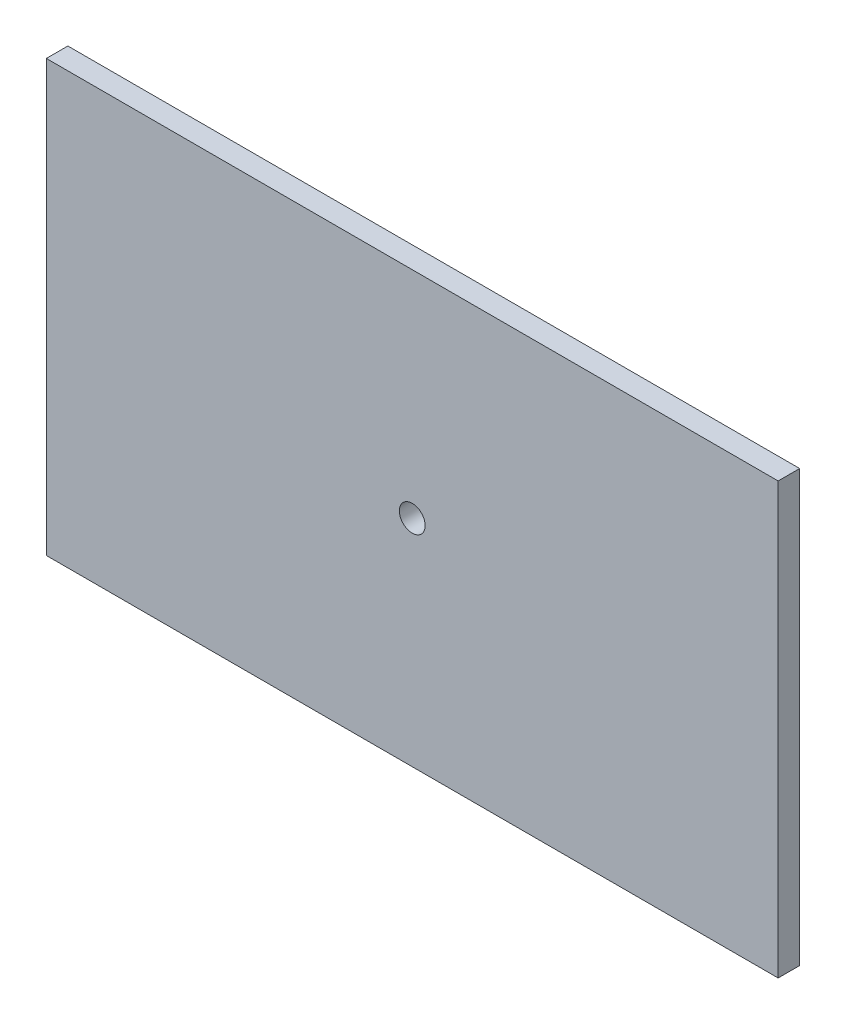
ISO-10303-21;
HEADER;
FILE_DESCRIPTION(('STEP AP214'),'2;1');
FILE_NAME('part.step','',(''),(''),'','','');
FILE_SCHEMA(('AUTOMOTIVE_DESIGN { 1 0 10303 214 1 1 1 1 }'));
ENDSEC;
DATA;
#1=APPLICATION_CONTEXT('core data for automotive mechanical design processes');
#2=APPLICATION_PROTOCOL_DEFINITION('international standard','automotive_design',2000,#1);
#3=PRODUCT_CONTEXT('',#1,'mechanical');
#4=PRODUCT('Part','Part','',(#3));
#5=PRODUCT_RELATED_PRODUCT_CATEGORY('part','',(#4));
#6=PRODUCT_DEFINITION_FORMATION('','',#4);
#7=PRODUCT_DEFINITION_CONTEXT('part definition',#1,'design');
#8=PRODUCT_DEFINITION('design','',#6,#7);
#9=PRODUCT_DEFINITION_SHAPE('','',#8);
#10=(LENGTH_UNIT() NAMED_UNIT(*) SI_UNIT(.MILLI.,.METRE.));
#11=(NAMED_UNIT(*) PLANE_ANGLE_UNIT() SI_UNIT($,.RADIAN.));
#12=(NAMED_UNIT(*) SI_UNIT($,.STERADIAN.) SOLID_ANGLE_UNIT());
#13=UNCERTAINTY_MEASURE_WITH_UNIT(LENGTH_MEASURE(1.E-05),#10,'distance_accuracy_value','');
#14=(GEOMETRIC_REPRESENTATION_CONTEXT(3) GLOBAL_UNCERTAINTY_ASSIGNED_CONTEXT((#13)) GLOBAL_UNIT_ASSIGNED_CONTEXT((#10,
#11,#12)) REPRESENTATION_CONTEXT('',''));
#15=CARTESIAN_POINT('',(0.,0.,0.));
#16=DIRECTION('',(0.,0.,1.));
#17=DIRECTION('',(1.,0.,0.));
#18=AXIS2_PLACEMENT_3D('',#15,#16,#17);
#19=CARTESIAN_POINT('',(-170.,-100.,10.));
#20=DIRECTION('',(1.,0.,0.));
#21=DIRECTION('',(0.,1.,0.));
#22=AXIS2_PLACEMENT_3D('',#19,#20,#21);
#23=PLANE('',#22);
#24=DIRECTION('',(0.,-1.,0.));
#25=VECTOR('',#24,1.);
#26=CARTESIAN_POINT('',(-170.,-100.,0.));
#27=LINE('',#26,#25);
#28=CARTESIAN_POINT('',(-170.,99.9999999999999,0.));
#29=VERTEX_POINT('',#28);
#30=CARTESIAN_POINT('',(-170.,-100.,0.));
#31=VERTEX_POINT('',#30);
#32=EDGE_CURVE('E106',#29,#31,#27,.T.);
#33=ORIENTED_EDGE('',*,*,#32,.T.);
#34=DIRECTION('',(0.,0.,-1.));
#35=VECTOR('',#34,1.);
#36=CARTESIAN_POINT('',(-170.,-100.,10.));
#37=LINE('',#36,#35);
#38=CARTESIAN_POINT('',(-170.,-100.,10.));
#39=VERTEX_POINT('',#38);
#40=EDGE_CURVE('E11',#39,#31,#37,.T.);
#41=ORIENTED_EDGE('',*,*,#40,.F.);
#42=DIRECTION('',(0.,-1.,0.));
#43=VECTOR('',#42,1.);
#44=CARTESIAN_POINT('',(-170.,-100.,10.));
#45=LINE('',#44,#43);
#46=CARTESIAN_POINT('',(-170.,99.9999999999999,10.));
#47=VERTEX_POINT('',#46);
#48=EDGE_CURVE('E90',#47,#39,#45,.T.);
#49=ORIENTED_EDGE('',*,*,#48,.F.);
#50=DIRECTION('',(0.,0.,-1.));
#51=VECTOR('',#50,1.);
#52=CARTESIAN_POINT('',(-170.,99.9999999999999,10.));
#53=LINE('',#52,#51);
#54=EDGE_CURVE('E102',#47,#29,#53,.T.);
#55=ORIENTED_EDGE('',*,*,#54,.T.);
#56=EDGE_LOOP('',(#33,#41,#49,#55));
#57=FACE_BOUND('',#56,.T.);
#58=ADVANCED_FACE('F38',(#57),#23,.F.);
#59=CARTESIAN_POINT('',(170.,-100.,10.));
#60=DIRECTION('',(0.,1.,0.));
#61=DIRECTION('',(-1.,0.,0.));
#62=AXIS2_PLACEMENT_3D('',#59,#60,#61);
#63=PLANE('',#62);
#64=DIRECTION('',(1.,0.,0.));
#65=VECTOR('',#64,1.);
#66=CARTESIAN_POINT('',(170.,-100.,0.));
#67=LINE('',#66,#65);
#68=CARTESIAN_POINT('',(170.,-100.,0.));
#69=VERTEX_POINT('',#68);
#70=EDGE_CURVE('E95',#31,#69,#67,.T.);
#71=ORIENTED_EDGE('',*,*,#70,.T.);
#72=DIRECTION('',(0.,0.,-1.));
#73=VECTOR('',#72,1.);
#74=CARTESIAN_POINT('',(170.,-100.,10.));
#75=LINE('',#74,#73);
#76=CARTESIAN_POINT('',(170.,-100.,10.));
#77=VERTEX_POINT('',#76);
#78=EDGE_CURVE('E47',#77,#69,#75,.T.);
#79=ORIENTED_EDGE('',*,*,#78,.F.);
#80=DIRECTION('',(1.,0.,0.));
#81=VECTOR('',#80,1.);
#82=CARTESIAN_POINT('',(170.,-100.,10.));
#83=LINE('',#82,#81);
#84=EDGE_CURVE('E85',#39,#77,#83,.T.);
#85=ORIENTED_EDGE('',*,*,#84,.F.);
#86=ORIENTED_EDGE('',*,*,#40,.T.);
#87=EDGE_LOOP('',(#71,#79,#85,#86));
#88=FACE_BOUND('',#87,.T.);
#89=ADVANCED_FACE('F94',(#88),#63,.F.);
#90=CARTESIAN_POINT('',(170.,-100.,10.));
#91=DIRECTION('',(-1.,0.,0.));
#92=DIRECTION('',(0.,0.,1.));
#93=AXIS2_PLACEMENT_3D('',#90,#91,#92);
#94=PLANE('',#93);
#95=DIRECTION('',(0.,1.,0.));
#96=VECTOR('',#95,1.);
#97=CARTESIAN_POINT('',(170.,-100.,0.));
#98=LINE('',#97,#96);
#99=CARTESIAN_POINT('',(170.,100.,0.));
#100=VERTEX_POINT('',#99);
#101=EDGE_CURVE('E72',#69,#100,#98,.T.);
#102=ORIENTED_EDGE('',*,*,#101,.T.);
#103=DIRECTION('',(0.,0.,-1.));
#104=VECTOR('',#103,1.);
#105=CARTESIAN_POINT('',(170.,100.,10.));
#106=LINE('',#105,#104);
#107=CARTESIAN_POINT('',(170.,100.,10.));
#108=VERTEX_POINT('',#107);
#109=EDGE_CURVE('E97',#108,#100,#106,.T.);
#110=ORIENTED_EDGE('',*,*,#109,.F.);
#111=DIRECTION('',(0.,1.,0.));
#112=VECTOR('',#111,1.);
#113=CARTESIAN_POINT('',(170.,-100.,10.));
#114=LINE('',#113,#112);
#115=EDGE_CURVE('E88',#77,#108,#114,.T.);
#116=ORIENTED_EDGE('',*,*,#115,.F.);
#117=ORIENTED_EDGE('',*,*,#78,.T.);
#118=EDGE_LOOP('',(#102,#110,#116,#117));
#119=FACE_BOUND('',#118,.T.);
#120=ADVANCED_FACE('F98',(#119),#94,.F.);
#121=CARTESIAN_POINT('',(170.,100.,10.));
#122=DIRECTION('',(0.,-1.,0.));
#123=DIRECTION('',(1.,0.,0.));
#124=AXIS2_PLACEMENT_3D('',#121,#122,#123);
#125=PLANE('',#124);
#126=DIRECTION('',(-1.,0.,0.));
#127=VECTOR('',#126,1.);
#128=CARTESIAN_POINT('',(170.,100.,0.));
#129=LINE('',#128,#127);
#130=EDGE_CURVE('E78',#100,#29,#129,.T.);
#131=ORIENTED_EDGE('',*,*,#130,.T.);
#132=ORIENTED_EDGE('',*,*,#54,.F.);
#133=DIRECTION('',(-1.,0.,0.));
#134=VECTOR('',#133,1.);
#135=CARTESIAN_POINT('',(170.,100.,10.));
#136=LINE('',#135,#134);
#137=EDGE_CURVE('E55',#108,#47,#136,.T.);
#138=ORIENTED_EDGE('',*,*,#137,.F.);
#139=ORIENTED_EDGE('',*,*,#109,.T.);
#140=EDGE_LOOP('',(#131,#132,#138,#139));
#141=FACE_BOUND('',#140,.T.);
#142=ADVANCED_FACE('F120',(#141),#125,.F.);
#143=CARTESIAN_POINT('',(0.,0.,10.));
#144=DIRECTION('',(0.,0.,1.));
#145=DIRECTION('',(1.,0.,0.));
#146=AXIS2_PLACEMENT_3D('',#143,#144,#145);
#147=PLANE('',#146);
#148=CARTESIAN_POINT('',(0.,0.,10.));
#149=DIRECTION('',(0.,0.,1.));
#150=DIRECTION('',(1.,0.,0.));
#151=AXIS2_PLACEMENT_3D('',#148,#149,#150);
#152=CIRCLE('',#151,6.);
#153=CARTESIAN_POINT('',(6.,0.,10.));
#154=VERTEX_POINT('',#153);
#155=EDGE_CURVE('E127',#154,#154,#152,.T.);
#156=ORIENTED_EDGE('',*,*,#155,.F.);
#157=EDGE_LOOP('',(#156));
#158=FACE_BOUND('',#157,.T.);
#159=ORIENTED_EDGE('',*,*,#48,.T.);
#160=ORIENTED_EDGE('',*,*,#84,.T.);
#161=ORIENTED_EDGE('',*,*,#115,.T.);
#162=ORIENTED_EDGE('',*,*,#137,.T.);
#163=EDGE_LOOP('',(#159,#160,#161,#162));
#164=FACE_BOUND('',#163,.T.);
#165=ADVANCED_FACE('F86',(#158,#164),#147,.T.);
#166=CARTESIAN_POINT('',(0.,0.,0.));
#167=DIRECTION('',(0.,0.,1.));
#168=DIRECTION('',(1.,0.,0.));
#169=AXIS2_PLACEMENT_3D('',#166,#167,#168);
#170=PLANE('',#169);
#171=CARTESIAN_POINT('',(0.,0.,0.));
#172=DIRECTION('',(0.,0.,1.));
#173=DIRECTION('',(1.,0.,0.));
#174=AXIS2_PLACEMENT_3D('',#171,#172,#173);
#175=CIRCLE('',#174,6.);
#176=CARTESIAN_POINT('',(6.,0.,0.));
#177=VERTEX_POINT('',#176);
#178=EDGE_CURVE('E110',#177,#177,#175,.T.);
#179=ORIENTED_EDGE('',*,*,#178,.T.);
#180=EDGE_LOOP('',(#179));
#181=FACE_BOUND('',#180,.T.);
#182=ORIENTED_EDGE('',*,*,#32,.F.);
#183=ORIENTED_EDGE('',*,*,#130,.F.);
#184=ORIENTED_EDGE('',*,*,#101,.F.);
#185=ORIENTED_EDGE('',*,*,#70,.F.);
#186=EDGE_LOOP('',(#182,#183,#184,#185));
#187=FACE_BOUND('',#186,.T.);
#188=ADVANCED_FACE('F123',(#181,#187),#170,.F.);
#189=CARTESIAN_POINT('',(0.,0.,0.));
#190=DIRECTION('',(0.,0.,1.));
#191=DIRECTION('',(1.,0.,0.));
#192=AXIS2_PLACEMENT_3D('',#189,#190,#191);
#193=CYLINDRICAL_SURFACE('',#192,6.);
#194=ORIENTED_EDGE('',*,*,#178,.F.);
#195=EDGE_LOOP('',(#194));
#196=FACE_BOUND('',#195,.T.);
#197=ORIENTED_EDGE('',*,*,#155,.T.);
#198=EDGE_LOOP('',(#197));
#199=FACE_BOUND('',#198,.T.);
#200=ADVANCED_FACE('F136',(#196,#199),#193,.F.);
#201=CLOSED_SHELL('',(#58,#89,#120,#142,#165,#188,#200));
#202=MANIFOLD_SOLID_BREP('B2',#201);
#203=ADVANCED_BREP_SHAPE_REPRESENTATION('',(#18,#202),#14);
#204=SHAPE_DEFINITION_REPRESENTATION(#9,#203);
ENDSEC;
END-ISO-10303-21;
